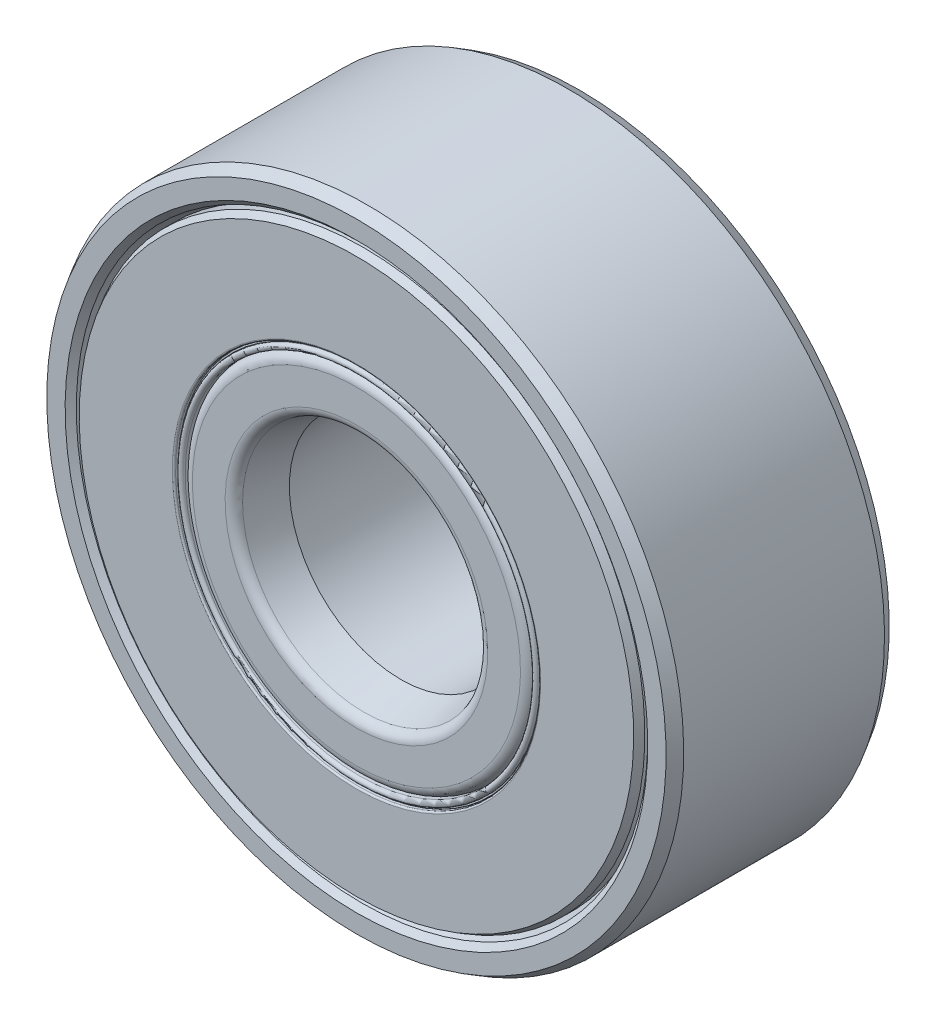
ISO-10303-21;
HEADER;
FILE_DESCRIPTION(('STEP AP214'),'2;1');
FILE_NAME('part.step','',(''),(''),'','','');
FILE_SCHEMA(('AUTOMOTIVE_DESIGN { 1 0 10303 214 1 1 1 1 }'));
ENDSEC;
DATA;
#1=APPLICATION_CONTEXT('core data for automotive mechanical design processes');
#2=APPLICATION_PROTOCOL_DEFINITION('international standard','automotive_design',2000,#1);
#3=PRODUCT_CONTEXT('',#1,'mechanical');
#4=PRODUCT('Part','Part','',(#3));
#5=PRODUCT_RELATED_PRODUCT_CATEGORY('part','',(#4));
#6=PRODUCT_DEFINITION_FORMATION('','',#4);
#7=PRODUCT_DEFINITION_CONTEXT('part definition',#1,'design');
#8=PRODUCT_DEFINITION('design','',#6,#7);
#9=PRODUCT_DEFINITION_SHAPE('','',#8);
#10=(LENGTH_UNIT() NAMED_UNIT(*) SI_UNIT(.MILLI.,.METRE.));
#11=(NAMED_UNIT(*) PLANE_ANGLE_UNIT() SI_UNIT($,.RADIAN.));
#12=(NAMED_UNIT(*) SI_UNIT($,.STERADIAN.) SOLID_ANGLE_UNIT());
#13=UNCERTAINTY_MEASURE_WITH_UNIT(LENGTH_MEASURE(1.E-05),#10,'distance_accuracy_value','');
#14=(GEOMETRIC_REPRESENTATION_CONTEXT(3) GLOBAL_UNCERTAINTY_ASSIGNED_CONTEXT((#13)) GLOBAL_UNIT_ASSIGNED_CONTEXT((#10,
#11,#12)) REPRESENTATION_CONTEXT('',''));
#15=CARTESIAN_POINT('',(0.,0.,0.));
#16=DIRECTION('',(0.,0.,1.));
#17=DIRECTION('',(1.,0.,0.));
#18=AXIS2_PLACEMENT_3D('',#15,#16,#17);
#19=CARTESIAN_POINT('',(0.,4.68666666666667,2.0625));
#20=DIRECTION('',(0.,0.,1.));
#21=DIRECTION('',(0.,-1.,0.));
#22=AXIS2_PLACEMENT_3D('',#19,#20,#21);
#23=PLANE('',#22);
#24=CARTESIAN_POINT('',(0.,0.,2.0625));
#25=DIRECTION('',(0.,0.,1.));
#26=DIRECTION('',(0.,-1.,0.));
#27=AXIS2_PLACEMENT_3D('',#24,#25,#26);
#28=CIRCLE('',#27,4.90666666666667);
#29=CARTESIAN_POINT('',(0.,-4.90666666666667,2.0625));
#30=VERTEX_POINT('',#29);
#31=EDGE_CURVE('E11',#30,#30,#28,.T.);
#32=ORIENTED_EDGE('',*,*,#31,.F.);
#33=EDGE_LOOP('',(#32));
#34=FACE_BOUND('',#33,.T.);
#35=CARTESIAN_POINT('',(0.,0.,2.0625));
#36=DIRECTION('',(0.,0.,1.));
#37=DIRECTION('',(0.,-1.,0.));
#38=AXIS2_PLACEMENT_3D('',#35,#36,#37);
#39=CIRCLE('',#38,4.68666666666667);
#40=CARTESIAN_POINT('',(0.,-4.68666666666667,2.0625));
#41=VERTEX_POINT('',#40);
#42=EDGE_CURVE('E66',#41,#41,#39,.T.);
#43=ORIENTED_EDGE('',*,*,#42,.T.);
#44=EDGE_LOOP('',(#43));
#45=FACE_BOUND('',#44,.T.);
#46=ADVANCED_FACE('F41',(#34,#45),#23,.F.);
#47=CARTESIAN_POINT('',(0.,0.,3.));
#48=DIRECTION('',(0.,0.,1.));
#49=DIRECTION('',(0.,-1.,0.));
#50=AXIS2_PLACEMENT_3D('',#47,#48,#49);
#51=CYLINDRICAL_SURFACE('',#50,4.90666666666667);
#52=CARTESIAN_POINT('',(0.,0.,2.84231187649393));
#53=DIRECTION('',(0.,0.,1.));
#54=DIRECTION('',(0.,-1.,0.));
#55=AXIS2_PLACEMENT_3D('',#52,#53,#54);
#56=CIRCLE('',#55,4.90666666666667);
#57=CARTESIAN_POINT('',(0.,-4.90666666666667,2.84231187649393));
#58=VERTEX_POINT('',#57);
#59=EDGE_CURVE('E47',#58,#58,#56,.T.);
#60=ORIENTED_EDGE('',*,*,#59,.F.);
#61=EDGE_LOOP('',(#60));
#62=FACE_BOUND('',#61,.T.);
#63=ORIENTED_EDGE('',*,*,#31,.T.);
#64=EDGE_LOOP('',(#63));
#65=FACE_BOUND('',#64,.T.);
#66=ADVANCED_FACE('F97',(#62,#65),#51,.T.);
#67=CARTESIAN_POINT('',(0.,0.,2.84231187649393));
#68=DIRECTION('',(0.,0.,-1.));
#69=DIRECTION('',(0.,1.,0.));
#70=AXIS2_PLACEMENT_3D('',#67,#68,#69);
#71=CONICAL_SURFACE('',#70,4.90666666666667,0.174532925199405);
#72=CARTESIAN_POINT('',(0.,0.,2.8964763029096));
#73=DIRECTION('',(0.,0.,1.));
#74=DIRECTION('',(0.,-1.,0.));
#75=AXIS2_PLACEMENT_3D('',#72,#73,#74);
#76=CIRCLE('',#75,4.89711601689499);
#77=CARTESIAN_POINT('',(0.,-4.89711601689499,2.8964763029096));
#78=VERTEX_POINT('',#77);
#79=EDGE_CURVE('E51',#78,#78,#76,.T.);
#80=ORIENTED_EDGE('',*,*,#79,.F.);
#81=EDGE_LOOP('',(#80));
#82=FACE_BOUND('',#81,.T.);
#83=ORIENTED_EDGE('',*,*,#59,.T.);
#84=EDGE_LOOP('',(#83));
#85=FACE_BOUND('',#84,.T.);
#86=ADVANCED_FACE('F92',(#82,#85),#71,.T.);
#87=CARTESIAN_POINT('',(0.,0.,2.8925));
#88=DIRECTION('',(0.,0.,1.));
#89=DIRECTION('',(0.,-1.,0.));
#90=AXIS2_PLACEMENT_3D('',#87,#88,#89);
#91=TOROIDAL_SURFACE('',#90,4.8745652824945,0.0228986158278282);
#92=CARTESIAN_POINT('',(0.,0.,2.8925));
#93=DIRECTION('',(0.,0.,1.));
#94=DIRECTION('',(0.,-1.,0.));
#95=AXIS2_PLACEMENT_3D('',#92,#93,#94);
#96=CIRCLE('',#95,4.85166666666667);
#97=CARTESIAN_POINT('',(0.,-4.85166666666667,2.8925));
#98=VERTEX_POINT('',#97);
#99=EDGE_CURVE('E55',#98,#98,#96,.T.);
#100=ORIENTED_EDGE('',*,*,#99,.F.);
#101=EDGE_LOOP('',(#100));
#102=FACE_BOUND('',#101,.T.);
#103=ORIENTED_EDGE('',*,*,#79,.T.);
#104=EDGE_LOOP('',(#103));
#105=FACE_BOUND('',#104,.T.);
#106=ADVANCED_FACE('F86',(#102,#105),#91,.T.);
#107=CARTESIAN_POINT('',(0.,0.,3.));
#108=DIRECTION('',(0.,0.,1.));
#109=DIRECTION('',(0.,-1.,0.));
#110=AXIS2_PLACEMENT_3D('',#107,#108,#109);
#111=CYLINDRICAL_SURFACE('',#110,4.85166666666667);
#112=CARTESIAN_POINT('',(0.,0.,2.9175));
#113=DIRECTION('',(0.,0.,1.));
#114=DIRECTION('',(0.,-1.,0.));
#115=AXIS2_PLACEMENT_3D('',#112,#113,#114);
#116=CIRCLE('',#115,4.85166666666667);
#117=CARTESIAN_POINT('',(0.,-4.85166666666667,2.9175));
#118=VERTEX_POINT('',#117);
#119=EDGE_CURVE('E60',#118,#118,#116,.T.);
#120=ORIENTED_EDGE('',*,*,#119,.F.);
#121=EDGE_LOOP('',(#120));
#122=FACE_BOUND('',#121,.T.);
#123=ORIENTED_EDGE('',*,*,#99,.T.);
#124=EDGE_LOOP('',(#123));
#125=FACE_BOUND('',#124,.T.);
#126=ADVANCED_FACE('F80',(#122,#125),#111,.T.);
#127=CARTESIAN_POINT('',(0.,0.,2.9175));
#128=DIRECTION('',(0.,0.,1.));
#129=DIRECTION('',(0.,-1.,0.));
#130=AXIS2_PLACEMENT_3D('',#127,#128,#129);
#131=TOROIDAL_SURFACE('',#130,4.76916666666667,0.0825000000000001);
#132=CARTESIAN_POINT('',(0.,0.,2.9175));
#133=DIRECTION('',(0.,0.,1.));
#134=DIRECTION('',(0.,-1.,0.));
#135=AXIS2_PLACEMENT_3D('',#132,#133,#134);
#136=CIRCLE('',#135,4.68666666666667);
#137=CARTESIAN_POINT('',(0.,-4.68666666666667,2.9175));
#138=VERTEX_POINT('',#137);
#139=EDGE_CURVE('E63',#138,#138,#136,.T.);
#140=ORIENTED_EDGE('',*,*,#139,.F.);
#141=EDGE_LOOP('',(#140));
#142=FACE_BOUND('',#141,.T.);
#143=ORIENTED_EDGE('',*,*,#119,.T.);
#144=EDGE_LOOP('',(#143));
#145=FACE_BOUND('',#144,.T.);
#146=ADVANCED_FACE('F74',(#142,#145),#131,.T.);
#147=CARTESIAN_POINT('',(0.,0.,3.));
#148=DIRECTION('',(0.,0.,1.));
#149=DIRECTION('',(0.,-1.,0.));
#150=AXIS2_PLACEMENT_3D('',#147,#148,#149);
#151=CYLINDRICAL_SURFACE('',#150,4.68666666666667);
#152=ORIENTED_EDGE('',*,*,#42,.F.);
#153=EDGE_LOOP('',(#152));
#154=FACE_BOUND('',#153,.T.);
#155=ORIENTED_EDGE('',*,*,#139,.T.);
#156=EDGE_LOOP('',(#155));
#157=FACE_BOUND('',#156,.T.);
#158=ADVANCED_FACE('F71',(#154,#157),#151,.F.);
#159=CLOSED_SHELL('',(#46,#66,#86,#106,#126,#146,#158));
#160=MANIFOLD_SOLID_BREP('B2',#159);
#161=CARTESIAN_POINT('',(0.,0.,-3.00000000000001));
#162=DIRECTION('',(0.,0.,1.));
#163=DIRECTION('',(0.,-1.,0.));
#164=AXIS2_PLACEMENT_3D('',#161,#162,#163);
#165=CONICAL_SURFACE('',#164,7.455,0.523598775598301);
#166=CARTESIAN_POINT('',(0.,0.,-2.80947441116743));
#167=DIRECTION('',(0.,0.,1.));
#168=DIRECTION('',(0.,-1.,0.));
#169=AXIS2_PLACEMENT_3D('',#166,#167,#168);
#170=CIRCLE('',#169,7.565);
#171=CARTESIAN_POINT('',(0.,-7.565,-2.80947441116743));
#172=VERTEX_POINT('',#171);
#173=EDGE_CURVE('E177',#172,#172,#170,.T.);
#174=ORIENTED_EDGE('',*,*,#173,.F.);
#175=EDGE_LOOP('',(#174));
#176=FACE_BOUND('',#175,.T.);
#177=CARTESIAN_POINT('',(0.,0.,-3.00000000000001));
#178=DIRECTION('',(0.,0.,1.));
#179=DIRECTION('',(0.,-1.,0.));
#180=AXIS2_PLACEMENT_3D('',#177,#178,#179);
#181=CIRCLE('',#180,7.455);
#182=CARTESIAN_POINT('',(0.,-7.455,-3.00000000000001));
#183=VERTEX_POINT('',#182);
#184=EDGE_CURVE('E40',#183,#183,#181,.T.);
#185=ORIENTED_EDGE('',*,*,#184,.T.);
#186=EDGE_LOOP('',(#185));
#187=FACE_BOUND('',#186,.T.);
#188=ADVANCED_FACE('F155',(#176,#187),#165,.T.);
#189=CARTESIAN_POINT('',(0.,7.455,-3.));
#190=DIRECTION('',(0.,0.,1.));
#191=DIRECTION('',(0.,-1.,0.));
#192=AXIS2_PLACEMENT_3D('',#189,#190,#191);
#193=PLANE('',#192);
#194=ORIENTED_EDGE('',*,*,#184,.F.);
#195=EDGE_LOOP('',(#194));
#196=FACE_BOUND('',#195,.T.);
#197=CARTESIAN_POINT('',(0.,0.,-3.00000000000001));
#198=DIRECTION('',(0.,0.,1.));
#199=DIRECTION('',(0.,-1.,0.));
#200=AXIS2_PLACEMENT_3D('',#197,#198,#199);
#201=CIRCLE('',#200,4.95066666666667);
#202=CARTESIAN_POINT('',(0.,-4.95066666666666,-3.00000000000001));
#203=VERTEX_POINT('',#202);
#204=EDGE_CURVE('E161',#203,#203,#201,.T.);
#205=ORIENTED_EDGE('',*,*,#204,.T.);
#206=EDGE_LOOP('',(#205));
#207=FACE_BOUND('',#206,.T.);
#208=ADVANCED_FACE('F184',(#196,#207),#193,.F.);
#209=CARTESIAN_POINT('',(0.,0.,-2.956));
#210=DIRECTION('',(0.,0.,1.));
#211=DIRECTION('',(0.,-1.,0.));
#212=AXIS2_PLACEMENT_3D('',#209,#210,#211);
#213=TOROIDAL_SURFACE('',#212,4.95066666666667,0.0439999999999996);
#214=ORIENTED_EDGE('',*,*,#204,.F.);
#215=EDGE_LOOP('',(#214));
#216=FACE_BOUND('',#215,.T.);
#217=CARTESIAN_POINT('',(0.,0.,-2.95600000000001));
#218=DIRECTION('',(0.,0.,1.));
#219=DIRECTION('',(0.,-1.,0.));
#220=AXIS2_PLACEMENT_3D('',#217,#218,#219);
#221=CIRCLE('',#220,4.90666666666667);
#222=CARTESIAN_POINT('',(0.,-4.90666666666667,-2.95600000000001));
#223=VERTEX_POINT('',#222);
#224=EDGE_CURVE('E165',#223,#223,#221,.T.);
#225=ORIENTED_EDGE('',*,*,#224,.T.);
#226=EDGE_LOOP('',(#225));
#227=FACE_BOUND('',#226,.T.);
#228=ADVANCED_FACE('F188',(#216,#227),#213,.T.);
#229=CARTESIAN_POINT('',(0.,0.,3.));
#230=DIRECTION('',(0.,0.,1.));
#231=DIRECTION('',(0.,-1.,0.));
#232=AXIS2_PLACEMENT_3D('',#229,#230,#231);
#233=CYLINDRICAL_SURFACE('',#232,4.90666666666667);
#234=ORIENTED_EDGE('',*,*,#224,.F.);
#235=EDGE_LOOP('',(#234));
#236=FACE_BOUND('',#235,.T.);
#237=CARTESIAN_POINT('',(0.,0.,-2.0625));
#238=DIRECTION('',(0.,0.,1.));
#239=DIRECTION('',(0.,-1.,0.));
#240=AXIS2_PLACEMENT_3D('',#237,#238,#239);
#241=CIRCLE('',#240,4.90666666666667);
#242=CARTESIAN_POINT('',(0.,-4.90666666666667,-2.0625));
#243=VERTEX_POINT('',#242);
#244=EDGE_CURVE('E169',#243,#243,#241,.T.);
#245=ORIENTED_EDGE('',*,*,#244,.T.);
#246=EDGE_LOOP('',(#245));
#247=FACE_BOUND('',#246,.T.);
#248=ADVANCED_FACE('F193',(#236,#247),#233,.F.);
#249=CARTESIAN_POINT('',(0.,7.565,-2.0625));
#250=DIRECTION('',(0.,0.,-1.));
#251=DIRECTION('',(0.,1.,0.));
#252=AXIS2_PLACEMENT_3D('',#249,#250,#251);
#253=PLANE('',#252);
#254=ORIENTED_EDGE('',*,*,#244,.F.);
#255=EDGE_LOOP('',(#254));
#256=FACE_BOUND('',#255,.T.);
#257=CARTESIAN_POINT('',(0.,0.,-2.0625));
#258=DIRECTION('',(0.,0.,1.));
#259=DIRECTION('',(0.,-1.,0.));
#260=AXIS2_PLACEMENT_3D('',#257,#258,#259);
#261=CIRCLE('',#260,7.565);
#262=CARTESIAN_POINT('',(0.,-7.565,-2.0625));
#263=VERTEX_POINT('',#262);
#264=EDGE_CURVE('E174',#263,#263,#261,.T.);
#265=ORIENTED_EDGE('',*,*,#264,.T.);
#266=EDGE_LOOP('',(#265));
#267=FACE_BOUND('',#266,.T.);
#268=ADVANCED_FACE('F199',(#256,#267),#253,.F.);
#269=CARTESIAN_POINT('',(0.,0.,3.));
#270=DIRECTION('',(0.,0.,1.));
#271=DIRECTION('',(0.,-1.,0.));
#272=AXIS2_PLACEMENT_3D('',#269,#270,#271);
#273=CYLINDRICAL_SURFACE('',#272,7.565);
#274=ORIENTED_EDGE('',*,*,#264,.F.);
#275=EDGE_LOOP('',(#274));
#276=FACE_BOUND('',#275,.T.);
#277=ORIENTED_EDGE('',*,*,#173,.T.);
#278=EDGE_LOOP('',(#277));
#279=FACE_BOUND('',#278,.T.);
#280=ADVANCED_FACE('F181',(#276,#279),#273,.T.);
#281=CLOSED_SHELL('',(#188,#208,#228,#248,#268,#280));
#282=MANIFOLD_SOLID_BREP('B6',#281);
#283=CARTESIAN_POINT('',(0.,7.565,2.0625));
#284=DIRECTION('',(0.,0.,1.));
#285=DIRECTION('',(0.,-1.,0.));
#286=AXIS2_PLACEMENT_3D('',#283,#284,#285);
#287=PLANE('',#286);
#288=CARTESIAN_POINT('',(0.,0.,2.0625));
#289=DIRECTION('',(0.,0.,1.));
#290=DIRECTION('',(0.,-1.,0.));
#291=AXIS2_PLACEMENT_3D('',#288,#289,#290);
#292=CIRCLE('',#291,7.565);
#293=CARTESIAN_POINT('',(0.,-7.565,2.0625));
#294=VERTEX_POINT('',#293);
#295=EDGE_CURVE('E154',#294,#294,#292,.T.);
#296=ORIENTED_EDGE('',*,*,#295,.F.);
#297=EDGE_LOOP('',(#296));
#298=FACE_BOUND('',#297,.T.);
#299=CARTESIAN_POINT('',(0.,0.,2.0625));
#300=DIRECTION('',(0.,0.,1.));
#301=DIRECTION('',(0.,-1.,0.));
#302=AXIS2_PLACEMENT_3D('',#299,#300,#301);
#303=CIRCLE('',#302,4.90666666666667);
#304=CARTESIAN_POINT('',(0.,-4.90666666666667,2.0625));
#305=VERTEX_POINT('',#304);
#306=EDGE_CURVE('E274',#305,#305,#303,.T.);
#307=ORIENTED_EDGE('',*,*,#306,.T.);
#308=EDGE_LOOP('',(#307));
#309=FACE_BOUND('',#308,.T.);
#310=ADVANCED_FACE('F252',(#298,#309),#287,.F.);
#311=CARTESIAN_POINT('',(0.,0.,3.));
#312=DIRECTION('',(0.,0.,1.));
#313=DIRECTION('',(0.,-1.,0.));
#314=AXIS2_PLACEMENT_3D('',#311,#312,#313);
#315=CYLINDRICAL_SURFACE('',#314,7.565);
#316=CARTESIAN_POINT('',(0.,0.,2.80947441116743));
#317=DIRECTION('',(0.,0.,1.));
#318=DIRECTION('',(0.,-1.,0.));
#319=AXIS2_PLACEMENT_3D('',#316,#317,#318);
#320=CIRCLE('',#319,7.565);
#321=CARTESIAN_POINT('',(0.,-7.565,2.80947441116742));
#322=VERTEX_POINT('',#321);
#323=EDGE_CURVE('E258',#322,#322,#320,.T.);
#324=ORIENTED_EDGE('',*,*,#323,.F.);
#325=EDGE_LOOP('',(#324));
#326=FACE_BOUND('',#325,.T.);
#327=ORIENTED_EDGE('',*,*,#295,.T.);
#328=EDGE_LOOP('',(#327));
#329=FACE_BOUND('',#328,.T.);
#330=ADVANCED_FACE('F299',(#326,#329),#315,.T.);
#331=CARTESIAN_POINT('',(0.,0.,2.80947441116743));
#332=DIRECTION('',(0.,0.,-1.));
#333=DIRECTION('',(0.,1.,0.));
#334=AXIS2_PLACEMENT_3D('',#331,#332,#333);
#335=CONICAL_SURFACE('',#334,7.565,0.523598775598301);
#336=CARTESIAN_POINT('',(0.,0.,3.));
#337=DIRECTION('',(0.,0.,1.));
#338=DIRECTION('',(0.,-1.,0.));
#339=AXIS2_PLACEMENT_3D('',#336,#337,#338);
#340=CIRCLE('',#339,7.455);
#341=CARTESIAN_POINT('',(0.,-7.455,3.));
#342=VERTEX_POINT('',#341);
#343=EDGE_CURVE('E262',#342,#342,#340,.T.);
#344=ORIENTED_EDGE('',*,*,#343,.F.);
#345=EDGE_LOOP('',(#344));
#346=FACE_BOUND('',#345,.T.);
#347=ORIENTED_EDGE('',*,*,#323,.T.);
#348=EDGE_LOOP('',(#347));
#349=FACE_BOUND('',#348,.T.);
#350=ADVANCED_FACE('F294',(#346,#349),#335,.T.);
#351=CARTESIAN_POINT('',(0.,7.455,3.));
#352=DIRECTION('',(0.,0.,-1.));
#353=DIRECTION('',(0.,1.,0.));
#354=AXIS2_PLACEMENT_3D('',#351,#352,#353);
#355=PLANE('',#354);
#356=CARTESIAN_POINT('',(0.,0.,3.));
#357=DIRECTION('',(0.,0.,1.));
#358=DIRECTION('',(0.,-1.,0.));
#359=AXIS2_PLACEMENT_3D('',#356,#357,#358);
#360=CIRCLE('',#359,4.95066666666667);
#361=CARTESIAN_POINT('',(0.,-4.95066666666667,3.));
#362=VERTEX_POINT('',#361);
#363=EDGE_CURVE('E266',#362,#362,#360,.T.);
#364=ORIENTED_EDGE('',*,*,#363,.F.);
#365=EDGE_LOOP('',(#364));
#366=FACE_BOUND('',#365,.T.);
#367=ORIENTED_EDGE('',*,*,#343,.T.);
#368=EDGE_LOOP('',(#367));
#369=FACE_BOUND('',#368,.T.);
#370=ADVANCED_FACE('F288',(#366,#369),#355,.F.);
#371=CARTESIAN_POINT('',(0.,0.,2.956));
#372=DIRECTION('',(0.,0.,1.));
#373=DIRECTION('',(0.,-1.,0.));
#374=AXIS2_PLACEMENT_3D('',#371,#372,#373);
#375=TOROIDAL_SURFACE('',#374,4.95066666666667,0.0439999999999996);
#376=CARTESIAN_POINT('',(0.,0.,2.956));
#377=DIRECTION('',(0.,0.,1.));
#378=DIRECTION('',(0.,-1.,0.));
#379=AXIS2_PLACEMENT_3D('',#376,#377,#378);
#380=CIRCLE('',#379,4.90666666666667);
#381=CARTESIAN_POINT('',(0.,-4.90666666666667,2.956));
#382=VERTEX_POINT('',#381);
#383=EDGE_CURVE('E271',#382,#382,#380,.T.);
#384=ORIENTED_EDGE('',*,*,#383,.F.);
#385=EDGE_LOOP('',(#384));
#386=FACE_BOUND('',#385,.T.);
#387=ORIENTED_EDGE('',*,*,#363,.T.);
#388=EDGE_LOOP('',(#387));
#389=FACE_BOUND('',#388,.T.);
#390=ADVANCED_FACE('F282',(#386,#389),#375,.T.);
#391=CARTESIAN_POINT('',(0.,0.,3.));
#392=DIRECTION('',(0.,0.,1.));
#393=DIRECTION('',(0.,-1.,0.));
#394=AXIS2_PLACEMENT_3D('',#391,#392,#393);
#395=CYLINDRICAL_SURFACE('',#394,4.90666666666667);
#396=ORIENTED_EDGE('',*,*,#306,.F.);
#397=EDGE_LOOP('',(#396));
#398=FACE_BOUND('',#397,.T.);
#399=ORIENTED_EDGE('',*,*,#383,.T.);
#400=EDGE_LOOP('',(#399));
#401=FACE_BOUND('',#400,.T.);
#402=ADVANCED_FACE('F279',(#398,#401),#395,.F.);
#403=CLOSED_SHELL('',(#310,#330,#350,#370,#390,#402));
#404=MANIFOLD_SOLID_BREP('B35',#403);
#405=CARTESIAN_POINT('',(-4.78936935635203,3.81939461121968,0.));
#406=DIRECTION('',(0.,0.,1.));
#407=DIRECTION('',(-0.781831482468022,0.623489801858743,0.));
#408=AXIS2_PLACEMENT_3D('',#405,#406,#407);
#409=SPHERICAL_SURFACE('',#408,2.0625);
#410=CARTESIAN_POINT('',(-4.78936935635203,3.81939461121968,2.0625));
#411=VERTEX_POINT('',#410);
#412=VERTEX_LOOP('',#411);
#413=FACE_BOUND('',#412,.T.);
#414=ADVANCED_FACE('F362',(#413),#409,.T.);
#415=CLOSED_SHELL('',(#414));
#416=MANIFOLD_SOLID_BREP('B149',#415);
#417=CARTESIAN_POINT('',(-5.9722459020405,-1.363126154594,0.));
#418=DIRECTION('',(0.,0.,1.));
#419=DIRECTION('',(-0.974927912181826,-0.222520933956305,0.));
#420=AXIS2_PLACEMENT_3D('',#417,#418,#419);
#421=SPHERICAL_SURFACE('',#420,2.0625);
#422=CARTESIAN_POINT('',(-5.9722459020405,-1.363126154594,2.0625));
#423=VERTEX_POINT('',#422);
#424=VERTEX_LOOP('',#423);
#425=FACE_BOUND('',#424,.T.);
#426=ADVANCED_FACE('F380',(#425),#421,.T.);
#427=CLOSED_SHELL('',(#426));
#428=MANIFOLD_SOLID_BREP('B248',#427);
#429=CARTESIAN_POINT('',(-2.65789947187768,-5.51918512329221,0.));
#430=DIRECTION('',(0.,0.,1.));
#431=DIRECTION('',(-0.433883739117565,-0.900968867902416,0.));
#432=AXIS2_PLACEMENT_3D('',#429,#430,#431);
#433=SPHERICAL_SURFACE('',#432,2.0625);
#434=CARTESIAN_POINT('',(-2.65789947187768,-5.51918512329222,2.0625));
#435=VERTEX_POINT('',#434);
#436=VERTEX_LOOP('',#435);
#437=FACE_BOUND('',#436,.T.);
#438=ADVANCED_FACE('F398',(#437),#433,.T.);
#439=CLOSED_SHELL('',(#438));
#440=MANIFOLD_SOLID_BREP('B358',#439);
#441=CARTESIAN_POINT('',(2.65789947187761,-5.51918512329225,0.));
#442=DIRECTION('',(0.,0.,1.));
#443=DIRECTION('',(0.433883739117553,-0.900968867902422,0.));
#444=AXIS2_PLACEMENT_3D('',#441,#442,#443);
#445=SPHERICAL_SURFACE('',#444,2.0625);
#446=CARTESIAN_POINT('',(2.65789947187761,-5.51918512329225,2.0625));
#447=VERTEX_POINT('',#446);
#448=VERTEX_LOOP('',#447);
#449=FACE_BOUND('',#448,.T.);
#450=ADVANCED_FACE('F416',(#449),#445,.T.);
#451=CLOSED_SHELL('',(#450));
#452=MANIFOLD_SOLID_BREP('B376',#451);
#453=CARTESIAN_POINT('',(5.97224590204048,-1.36312615459408,0.));
#454=DIRECTION('',(0.,0.,1.));
#455=DIRECTION('',(0.974927912181823,-0.222520933956318,0.));
#456=AXIS2_PLACEMENT_3D('',#453,#454,#455);
#457=SPHERICAL_SURFACE('',#456,2.0625);
#458=CARTESIAN_POINT('',(5.97224590204048,-1.36312615459408,2.0625));
#459=VERTEX_POINT('',#458);
#460=VERTEX_LOOP('',#459);
#461=FACE_BOUND('',#460,.T.);
#462=ADVANCED_FACE('F434',(#461),#457,.T.);
#463=CLOSED_SHELL('',(#462));
#464=MANIFOLD_SOLID_BREP('B394',#463);
#465=CARTESIAN_POINT('',(4.78936935635208,3.81939461121962,0.));
#466=DIRECTION('',(0.,0.,1.));
#467=DIRECTION('',(0.781831482468031,0.623489801858732,0.));
#468=AXIS2_PLACEMENT_3D('',#465,#466,#467);
#469=SPHERICAL_SURFACE('',#468,2.0625);
#470=CARTESIAN_POINT('',(4.78936935635208,3.81939461121962,2.0625));
#471=VERTEX_POINT('',#470);
#472=VERTEX_LOOP('',#471);
#473=FACE_BOUND('',#472,.T.);
#474=ADVANCED_FACE('F452',(#473),#469,.T.);
#475=CLOSED_SHELL('',(#474));
#476=MANIFOLD_SOLID_BREP('B412',#475);
#477=CARTESIAN_POINT('',(0.,6.12583333333333,0.));
#478=DIRECTION('',(0.,0.,1.));
#479=DIRECTION('',(0.,1.,0.));
#480=AXIS2_PLACEMENT_3D('',#477,#478,#479);
#481=SPHERICAL_SURFACE('',#480,2.0625);
#482=CARTESIAN_POINT('',(0.,6.12583333333333,2.0625));
#483=VERTEX_POINT('',#482);
#484=VERTEX_LOOP('',#483);
#485=FACE_BOUND('',#484,.T.);
#486=ADVANCED_FACE('F472',(#485),#481,.T.);
#487=CLOSED_SHELL('',(#486));
#488=MANIFOLD_SOLID_BREP('B430',#487);
#489=CARTESIAN_POINT('',(0.,0.,-2.72478908204099));
#490=DIRECTION('',(0.,0.,1.));
#491=DIRECTION('',(0.,-1.,0.));
#492=AXIS2_PLACEMENT_3D('',#489,#490,#491);
#493=TOROIDAL_SURFACE('',#492,3.53166666666667,0.275210917959015);
#494=CARTESIAN_POINT('',(0.,0.,-3.));
#495=DIRECTION('',(0.,0.,1.));
#496=DIRECTION('',(0.,-1.,0.));
#497=AXIS2_PLACEMENT_3D('',#494,#495,#496);
#498=CIRCLE('',#497,3.53166666666667);
#499=CARTESIAN_POINT('',(0.,-3.53166666666666,-3.));
#500=VERTEX_POINT('',#499);
#501=EDGE_CURVE('E471',#500,#500,#498,.T.);
#502=ORIENTED_EDGE('',*,*,#501,.F.);
#503=EDGE_LOOP('',(#502));
#504=FACE_BOUND('',#503,.T.);
#505=CARTESIAN_POINT('',(0.,0.,-2.79601890902893));
#506=DIRECTION('',(0.,0.,1.));
#507=DIRECTION('',(0.,-1.,0.));
#508=AXIS2_PLACEMENT_3D('',#505,#506,#507);
#509=CIRCLE('',#508,3.26583333333333);
#510=CARTESIAN_POINT('',(0.,-3.26583333333333,-2.79601890902893));
#511=VERTEX_POINT('',#510);
#512=EDGE_CURVE('E531',#511,#511,#509,.T.);
#513=ORIENTED_EDGE('',*,*,#512,.T.);
#514=EDGE_LOOP('',(#513));
#515=FACE_BOUND('',#514,.T.);
#516=ADVANCED_FACE('F491',(#504,#515),#493,.T.);
#517=CARTESIAN_POINT('',(0.,3.53166666666667,-3.));
#518=DIRECTION('',(0.,0.,1.));
#519=DIRECTION('',(0.,-1.,0.));
#520=AXIS2_PLACEMENT_3D('',#517,#518,#519);
#521=PLANE('',#520);
#522=CARTESIAN_POINT('',(0.,0.,-3.));
#523=DIRECTION('',(0.,0.,1.));
#524=DIRECTION('',(0.,-1.,0.));
#525=AXIS2_PLACEMENT_3D('',#522,#523,#524);
#526=CIRCLE('',#525,4.41145574870765);
#527=CARTESIAN_POINT('',(0.,-4.41145574870765,-3.));
#528=VERTEX_POINT('',#527);
#529=EDGE_CURVE('E497',#528,#528,#526,.T.);
#530=ORIENTED_EDGE('',*,*,#529,.F.);
#531=EDGE_LOOP('',(#530));
#532=FACE_BOUND('',#531,.T.);
#533=ORIENTED_EDGE('',*,*,#501,.T.);
#534=EDGE_LOOP('',(#533));
#535=FACE_BOUND('',#534,.T.);
#536=ADVANCED_FACE('F592',(#532,#535),#521,.F.);
#537=CARTESIAN_POINT('',(0.,0.,-2.72478908204099));
#538=DIRECTION('',(0.,0.,1.));
#539=DIRECTION('',(0.,-1.,0.));
#540=AXIS2_PLACEMENT_3D('',#537,#538,#539);
#541=TOROIDAL_SURFACE('',#540,4.41145574870765,0.275210917959014);
#542=CARTESIAN_POINT('',(0.,0.,-2.72478908204099));
#543=DIRECTION('',(0.,0.,1.));
#544=DIRECTION('',(0.,-1.,0.));
#545=AXIS2_PLACEMENT_3D('',#542,#543,#544);
#546=CIRCLE('',#545,4.68666666666667);
#547=CARTESIAN_POINT('',(0.,-4.68666666666666,-2.72478908204099));
#548=VERTEX_POINT('',#547);
#549=EDGE_CURVE('E501',#548,#548,#546,.T.);
#550=ORIENTED_EDGE('',*,*,#549,.F.);
#551=EDGE_LOOP('',(#550));
#552=FACE_BOUND('',#551,.T.);
#553=ORIENTED_EDGE('',*,*,#529,.T.);
#554=EDGE_LOOP('',(#553));
#555=FACE_BOUND('',#554,.T.);
#556=ADVANCED_FACE('F587',(#552,#555),#541,.T.);
#557=CARTESIAN_POINT('',(0.,0.,3.));
#558=DIRECTION('',(0.,0.,1.));
#559=DIRECTION('',(0.,-1.,0.));
#560=AXIS2_PLACEMENT_3D('',#557,#558,#559);
#561=CYLINDRICAL_SURFACE('',#560,4.68666666666667);
#562=CARTESIAN_POINT('',(0.,0.,-1.47739823864643));
#563=DIRECTION('',(0.,0.,1.));
#564=DIRECTION('',(0.,-1.,0.));
#565=AXIS2_PLACEMENT_3D('',#562,#563,#564);
#566=CIRCLE('',#565,4.68666666666667);
#567=CARTESIAN_POINT('',(0.,-4.68666666666667,-1.47739823864643));
#568=VERTEX_POINT('',#567);
#569=EDGE_CURVE('E505',#568,#568,#566,.T.);
#570=ORIENTED_EDGE('',*,*,#569,.F.);
#571=EDGE_LOOP('',(#570));
#572=FACE_BOUND('',#571,.T.);
#573=ORIENTED_EDGE('',*,*,#549,.T.);
#574=EDGE_LOOP('',(#573));
#575=FACE_BOUND('',#574,.T.);
#576=ADVANCED_FACE('F581',(#572,#575),#561,.T.);
#577=CARTESIAN_POINT('',(0.,0.,0.));
#578=DIRECTION('',(0.,0.,1.));
#579=DIRECTION('',(0.,-1.,0.));
#580=AXIS2_PLACEMENT_3D('',#577,#578,#579);
#581=TOROIDAL_SURFACE('',#580,6.12583333333333,2.0625);
#582=CARTESIAN_POINT('',(0.,0.,1.47739823864642));
#583=DIRECTION('',(0.,0.,1.));
#584=DIRECTION('',(0.,-1.,0.));
#585=AXIS2_PLACEMENT_3D('',#582,#583,#584);
#586=CIRCLE('',#585,4.68666666666667);
#587=CARTESIAN_POINT('',(0.,-4.68666666666667,1.47739823864642));
#588=VERTEX_POINT('',#587);
#589=EDGE_CURVE('E510',#588,#588,#586,.T.);
#590=ORIENTED_EDGE('',*,*,#589,.F.);
#591=EDGE_LOOP('',(#590));
#592=FACE_BOUND('',#591,.T.);
#593=ORIENTED_EDGE('',*,*,#569,.T.);
#594=EDGE_LOOP('',(#593));
#595=FACE_BOUND('',#594,.T.);
#596=ADVANCED_FACE('F575',(#592,#595),#581,.F.);
#597=CARTESIAN_POINT('',(0.,0.,3.));
#598=DIRECTION('',(0.,0.,1.));
#599=DIRECTION('',(0.,-1.,0.));
#600=AXIS2_PLACEMENT_3D('',#597,#598,#599);
#601=CYLINDRICAL_SURFACE('',#600,4.68666666666667);
#602=CARTESIAN_POINT('',(0.,0.,2.72478908204099));
#603=DIRECTION('',(0.,0.,1.));
#604=DIRECTION('',(0.,-1.,0.));
#605=AXIS2_PLACEMENT_3D('',#602,#603,#604);
#606=CIRCLE('',#605,4.68666666666667);
#607=CARTESIAN_POINT('',(0.,-4.68666666666667,2.72478908204099));
#608=VERTEX_POINT('',#607);
#609=EDGE_CURVE('E513',#608,#608,#606,.T.);
#610=ORIENTED_EDGE('',*,*,#609,.F.);
#611=EDGE_LOOP('',(#610));
#612=FACE_BOUND('',#611,.T.);
#613=ORIENTED_EDGE('',*,*,#589,.T.);
#614=EDGE_LOOP('',(#613));
#615=FACE_BOUND('',#614,.T.);
#616=ADVANCED_FACE('F569',(#612,#615),#601,.T.);
#617=CARTESIAN_POINT('',(0.,0.,2.72478908204099));
#618=DIRECTION('',(0.,0.,1.));
#619=DIRECTION('',(0.,-1.,0.));
#620=AXIS2_PLACEMENT_3D('',#617,#618,#619);
#621=TOROIDAL_SURFACE('',#620,4.41145574870765,0.275210917959014);
#622=CARTESIAN_POINT('',(0.,0.,3.));
#623=DIRECTION('',(0.,0.,1.));
#624=DIRECTION('',(0.,-1.,0.));
#625=AXIS2_PLACEMENT_3D('',#622,#623,#624);
#626=CIRCLE('',#625,4.41145574870765);
#627=CARTESIAN_POINT('',(0.,-4.41145574870765,3.));
#628=VERTEX_POINT('',#627);
#629=EDGE_CURVE('E516',#628,#628,#626,.T.);
#630=ORIENTED_EDGE('',*,*,#629,.F.);
#631=EDGE_LOOP('',(#630));
#632=FACE_BOUND('',#631,.T.);
#633=ORIENTED_EDGE('',*,*,#609,.T.);
#634=EDGE_LOOP('',(#633));
#635=FACE_BOUND('',#634,.T.);
#636=ADVANCED_FACE('F563',(#632,#635),#621,.T.);
#637=CARTESIAN_POINT('',(0.,3.53166666666667,3.));
#638=DIRECTION('',(0.,0.,-1.));
#639=DIRECTION('',(0.,1.,0.));
#640=AXIS2_PLACEMENT_3D('',#637,#638,#639);
#641=PLANE('',#640);
#642=CARTESIAN_POINT('',(0.,0.,3.));
#643=DIRECTION('',(0.,0.,1.));
#644=DIRECTION('',(0.,-1.,0.));
#645=AXIS2_PLACEMENT_3D('',#642,#643,#644);
#646=CIRCLE('',#645,3.53166666666667);
#647=CARTESIAN_POINT('',(0.,-3.53166666666667,3.));
#648=VERTEX_POINT('',#647);
#649=EDGE_CURVE('E519',#648,#648,#646,.T.);
#650=ORIENTED_EDGE('',*,*,#649,.F.);
#651=EDGE_LOOP('',(#650));
#652=FACE_BOUND('',#651,.T.);
#653=ORIENTED_EDGE('',*,*,#629,.T.);
#654=EDGE_LOOP('',(#653));
#655=FACE_BOUND('',#654,.T.);
#656=ADVANCED_FACE('F557',(#652,#655),#641,.F.);
#657=CARTESIAN_POINT('',(0.,0.,2.72478908204099));
#658=DIRECTION('',(0.,0.,1.));
#659=DIRECTION('',(0.,-1.,0.));
#660=AXIS2_PLACEMENT_3D('',#657,#658,#659);
#661=TOROIDAL_SURFACE('',#660,3.53166666666667,0.275210917959015);
#662=CARTESIAN_POINT('',(0.,0.,2.79601890902893));
#663=DIRECTION('',(0.,0.,1.));
#664=DIRECTION('',(0.,-1.,0.));
#665=AXIS2_PLACEMENT_3D('',#662,#663,#664);
#666=CIRCLE('',#665,3.26583333333333);
#667=CARTESIAN_POINT('',(0.,-3.26583333333333,2.79601890902893));
#668=VERTEX_POINT('',#667);
#669=EDGE_CURVE('E522',#668,#668,#666,.T.);
#670=ORIENTED_EDGE('',*,*,#669,.F.);
#671=EDGE_LOOP('',(#670));
#672=FACE_BOUND('',#671,.T.);
#673=ORIENTED_EDGE('',*,*,#649,.T.);
#674=EDGE_LOOP('',(#673));
#675=FACE_BOUND('',#674,.T.);
#676=ADVANCED_FACE('F551',(#672,#675),#661,.T.);
#677=CARTESIAN_POINT('',(0.,0.,2.79601890902893));
#678=DIRECTION('',(0.,0.,1.));
#679=DIRECTION('',(0.,-1.,0.));
#680=AXIS2_PLACEMENT_3D('',#677,#678,#679);
#681=CONICAL_SURFACE('',#680,3.26583333333333,0.261799387799149);
#682=CARTESIAN_POINT('',(0.,0.,1.80391540268354));
#683=DIRECTION('',(0.,0.,1.));
#684=DIRECTION('',(0.,-1.,0.));
#685=AXIS2_PLACEMENT_3D('',#682,#683,#684);
#686=CIRCLE('',#685,3.);
#687=CARTESIAN_POINT('',(0.,-3.,1.80391540268353));
#688=VERTEX_POINT('',#687);
#689=EDGE_CURVE('E525',#688,#688,#686,.T.);
#690=ORIENTED_EDGE('',*,*,#689,.F.);
#691=EDGE_LOOP('',(#690));
#692=FACE_BOUND('',#691,.T.);
#693=ORIENTED_EDGE('',*,*,#669,.T.);
#694=EDGE_LOOP('',(#693));
#695=FACE_BOUND('',#694,.T.);
#696=ADVANCED_FACE('F545',(#692,#695),#681,.F.);
#697=CARTESIAN_POINT('',(0.,0.,3.));
#698=DIRECTION('',(0.,0.,1.));
#699=DIRECTION('',(0.,-1.,0.));
#700=AXIS2_PLACEMENT_3D('',#697,#698,#699);
#701=CYLINDRICAL_SURFACE('',#700,3.);
#702=CARTESIAN_POINT('',(0.,0.,-1.80391540268354));
#703=DIRECTION('',(0.,0.,1.));
#704=DIRECTION('',(0.,-1.,0.));
#705=AXIS2_PLACEMENT_3D('',#702,#703,#704);
#706=CIRCLE('',#705,3.);
#707=CARTESIAN_POINT('',(0.,-3.,-1.80391540268354));
#708=VERTEX_POINT('',#707);
#709=EDGE_CURVE('E528',#708,#708,#706,.T.);
#710=ORIENTED_EDGE('',*,*,#709,.F.);
#711=EDGE_LOOP('',(#710));
#712=FACE_BOUND('',#711,.T.);
#713=ORIENTED_EDGE('',*,*,#689,.T.);
#714=EDGE_LOOP('',(#713));
#715=FACE_BOUND('',#714,.T.);
#716=ADVANCED_FACE('F539',(#712,#715),#701,.F.);
#717=CARTESIAN_POINT('',(0.,0.,-1.80391540268354));
#718=DIRECTION('',(0.,0.,-1.));
#719=DIRECTION('',(0.,1.,0.));
#720=AXIS2_PLACEMENT_3D('',#717,#718,#719);
#721=CONICAL_SURFACE('',#720,3.,0.261799387799149);
#722=ORIENTED_EDGE('',*,*,#512,.F.);
#723=EDGE_LOOP('',(#722));
#724=FACE_BOUND('',#723,.T.);
#725=ORIENTED_EDGE('',*,*,#709,.T.);
#726=EDGE_LOOP('',(#725));
#727=FACE_BOUND('',#726,.T.);
#728=ADVANCED_FACE('F536',(#724,#727),#721,.F.);
#729=CLOSED_SHELL('',(#516,#536,#556,#576,#596,#616,#636,#656,#676,#696,#716,#728));
#730=MANIFOLD_SOLID_BREP('B448',#729);
#731=CARTESIAN_POINT('',(0.,0.,3.));
#732=DIRECTION('',(0.,0.,1.));
#733=DIRECTION('',(0.,-1.,0.));
#734=AXIS2_PLACEMENT_3D('',#731,#732,#733);
#735=CYLINDRICAL_SURFACE('',#734,7.565);
#736=CARTESIAN_POINT('',(0.,0.,1.47739823864642));
#737=DIRECTION('',(0.,0.,1.));
#738=DIRECTION('',(0.,-1.,0.));
#739=AXIS2_PLACEMENT_3D('',#736,#737,#738);
#740=CIRCLE('',#739,7.565);
#741=CARTESIAN_POINT('',(0.,-7.565,1.47739823864642));
#742=VERTEX_POINT('',#741);
#743=EDGE_CURVE('E490',#742,#742,#740,.T.);
#744=ORIENTED_EDGE('',*,*,#743,.F.);
#745=EDGE_LOOP('',(#744));
#746=FACE_BOUND('',#745,.T.);
#747=CARTESIAN_POINT('',(0.,0.,2.52448092746025));
#748=DIRECTION('',(0.,0.,1.));
#749=DIRECTION('',(0.,-1.,0.));
#750=AXIS2_PLACEMENT_3D('',#747,#748,#749);
#751=CIRCLE('',#750,7.565);
#752=CARTESIAN_POINT('',(0.,-7.565,2.52448092746025));
#753=VERTEX_POINT('',#752);
#754=EDGE_CURVE('E712',#753,#753,#751,.T.);
#755=ORIENTED_EDGE('',*,*,#754,.T.);
#756=EDGE_LOOP('',(#755));
#757=FACE_BOUND('',#756,.T.);
#758=ADVANCED_FACE('F672',(#746,#757),#735,.F.);
#759=CARTESIAN_POINT('',(0.,0.,0.));
#760=DIRECTION('',(0.,0.,1.));
#761=DIRECTION('',(0.,-1.,0.));
#762=AXIS2_PLACEMENT_3D('',#759,#760,#761);
#763=TOROIDAL_SURFACE('',#762,6.12583333333333,2.0625);
#764=CARTESIAN_POINT('',(0.,0.,-1.47739823864643));
#765=DIRECTION('',(0.,0.,1.));
#766=DIRECTION('',(0.,-1.,0.));
#767=AXIS2_PLACEMENT_3D('',#764,#765,#766);
#768=CIRCLE('',#767,7.565);
#769=CARTESIAN_POINT('',(0.,-7.565,-1.47739823864643));
#770=VERTEX_POINT('',#769);
#771=EDGE_CURVE('E678',#770,#770,#768,.T.);
#772=ORIENTED_EDGE('',*,*,#771,.F.);
#773=EDGE_LOOP('',(#772));
#774=FACE_BOUND('',#773,.T.);
#775=ORIENTED_EDGE('',*,*,#743,.T.);
#776=EDGE_LOOP('',(#775));
#777=FACE_BOUND('',#776,.T.);
#778=ADVANCED_FACE('F773',(#774,#777),#763,.F.);
#779=CARTESIAN_POINT('',(0.,0.,3.));
#780=DIRECTION('',(0.,0.,1.));
#781=DIRECTION('',(0.,-1.,0.));
#782=AXIS2_PLACEMENT_3D('',#779,#780,#781);
#783=CYLINDRICAL_SURFACE('',#782,7.565);
#784=CARTESIAN_POINT('',(0.,0.,-2.52448092746026));
#785=DIRECTION('',(0.,0.,1.));
#786=DIRECTION('',(0.,-1.,0.));
#787=AXIS2_PLACEMENT_3D('',#784,#785,#786);
#788=CIRCLE('',#787,7.565);
#789=CARTESIAN_POINT('',(0.,-7.565,-2.52448092746026));
#790=VERTEX_POINT('',#789);
#791=EDGE_CURVE('E682',#790,#790,#788,.T.);
#792=ORIENTED_EDGE('',*,*,#791,.F.);
#793=EDGE_LOOP('',(#792));
#794=FACE_BOUND('',#793,.T.);
#795=ORIENTED_EDGE('',*,*,#771,.T.);
#796=EDGE_LOOP('',(#795));
#797=FACE_BOUND('',#796,.T.);
#798=ADVANCED_FACE('F768',(#794,#797),#783,.F.);
#799=CARTESIAN_POINT('',(0.,0.,-2.52448092746026));
#800=DIRECTION('',(0.,0.,-1.));
#801=DIRECTION('',(0.,1.,0.));
#802=AXIS2_PLACEMENT_3D('',#799,#800,#801);
#803=CONICAL_SURFACE('',#802,7.565,0.349065850398859);
#804=CARTESIAN_POINT('',(0.,0.,-2.85));
#805=DIRECTION('',(0.,0.,1.));
#806=DIRECTION('',(0.,-1.,0.));
#807=AXIS2_PLACEMENT_3D('',#804,#805,#806);
#808=CIRCLE('',#807,7.68347925309041);
#809=CARTESIAN_POINT('',(0.,-7.68347925309041,-2.85000000000001));
#810=VERTEX_POINT('',#809);
#811=EDGE_CURVE('E686',#810,#810,#808,.T.);
#812=ORIENTED_EDGE('',*,*,#811,.F.);
#813=EDGE_LOOP('',(#812));
#814=FACE_BOUND('',#813,.T.);
#815=ORIENTED_EDGE('',*,*,#791,.T.);
#816=EDGE_LOOP('',(#815));
#817=FACE_BOUND('',#816,.T.);
#818=ADVANCED_FACE('F762',(#814,#817),#803,.F.);
#819=CARTESIAN_POINT('',(0.,0.,-2.85));
#820=DIRECTION('',(0.,0.,-1.));
#821=DIRECTION('',(0.,1.,0.));
#822=AXIS2_PLACEMENT_3D('',#819,#820,#821);
#823=CONICAL_SURFACE('',#822,7.68347925309041,0.785398163397437);
#824=CARTESIAN_POINT('',(0.,0.,-3.));
#825=DIRECTION('',(0.,0.,1.));
#826=DIRECTION('',(0.,-1.,0.));
#827=AXIS2_PLACEMENT_3D('',#824,#825,#826);
#828=CIRCLE('',#827,7.8334792530904);
#829=CARTESIAN_POINT('',(0.,-7.8334792530904,-3.00000000000001));
#830=VERTEX_POINT('',#829);
#831=EDGE_CURVE('E691',#830,#830,#828,.T.);
#832=ORIENTED_EDGE('',*,*,#831,.F.);
#833=EDGE_LOOP('',(#832));
#834=FACE_BOUND('',#833,.T.);
#835=ORIENTED_EDGE('',*,*,#811,.T.);
#836=EDGE_LOOP('',(#835));
#837=FACE_BOUND('',#836,.T.);
#838=ADVANCED_FACE('F756',(#834,#837),#823,.F.);
#839=CARTESIAN_POINT('',(0.,8.32679491924311,-3.));
#840=DIRECTION('',(0.,0.,1.));
#841=DIRECTION('',(0.,-1.,0.));
#842=AXIS2_PLACEMENT_3D('',#839,#840,#841);
#843=PLANE('',#842);
#844=CARTESIAN_POINT('',(0.,0.,-3.));
#845=DIRECTION('',(0.,0.,1.));
#846=DIRECTION('',(0.,-1.,0.));
#847=AXIS2_PLACEMENT_3D('',#844,#845,#846);
#848=CIRCLE('',#847,8.32679491924311);
#849=CARTESIAN_POINT('',(0.,-8.32679491924311,-3.00000000000001));
#850=VERTEX_POINT('',#849);
#851=EDGE_CURVE('E694',#850,#850,#848,.T.);
#852=ORIENTED_EDGE('',*,*,#851,.F.);
#853=EDGE_LOOP('',(#852));
#854=FACE_BOUND('',#853,.T.);
#855=ORIENTED_EDGE('',*,*,#831,.T.);
#856=EDGE_LOOP('',(#855));
#857=FACE_BOUND('',#856,.T.);
#858=ADVANCED_FACE('F750',(#854,#857),#843,.F.);
#859=CARTESIAN_POINT('',(0.,0.,-3.));
#860=DIRECTION('',(0.,0.,1.));
#861=DIRECTION('',(0.,-1.,0.));
#862=AXIS2_PLACEMENT_3D('',#859,#860,#861);
#863=CONICAL_SURFACE('',#862,8.32679491924311,0.523598775598291);
#864=CARTESIAN_POINT('',(0.,0.,-2.7));
#865=DIRECTION('',(0.,0.,1.));
#866=DIRECTION('',(0.,-1.,0.));
#867=AXIS2_PLACEMENT_3D('',#864,#865,#866);
#868=CIRCLE('',#867,8.5);
#869=CARTESIAN_POINT('',(0.,-8.5,-2.70000000000001));
#870=VERTEX_POINT('',#869);
#871=EDGE_CURVE('E697',#870,#870,#868,.T.);
#872=ORIENTED_EDGE('',*,*,#871,.F.);
#873=EDGE_LOOP('',(#872));
#874=FACE_BOUND('',#873,.T.);
#875=ORIENTED_EDGE('',*,*,#851,.T.);
#876=EDGE_LOOP('',(#875));
#877=FACE_BOUND('',#876,.T.);
#878=ADVANCED_FACE('F744',(#874,#877),#863,.T.);
#879=CARTESIAN_POINT('',(0.,0.,3.));
#880=DIRECTION('',(0.,0.,1.));
#881=DIRECTION('',(0.,-1.,0.));
#882=AXIS2_PLACEMENT_3D('',#879,#880,#881);
#883=CYLINDRICAL_SURFACE('',#882,8.5);
#884=CARTESIAN_POINT('',(0.,0.,2.7));
#885=DIRECTION('',(0.,0.,1.));
#886=DIRECTION('',(0.,-1.,0.));
#887=AXIS2_PLACEMENT_3D('',#884,#885,#886);
#888=CIRCLE('',#887,8.5);
#889=CARTESIAN_POINT('',(0.,-8.5,2.7));
#890=VERTEX_POINT('',#889);
#891=EDGE_CURVE('E700',#890,#890,#888,.T.);
#892=ORIENTED_EDGE('',*,*,#891,.F.);
#893=EDGE_LOOP('',(#892));
#894=FACE_BOUND('',#893,.T.);
#895=ORIENTED_EDGE('',*,*,#871,.T.);
#896=EDGE_LOOP('',(#895));
#897=FACE_BOUND('',#896,.T.);
#898=ADVANCED_FACE('F738',(#894,#897),#883,.T.);
#899=CARTESIAN_POINT('',(0.,0.,2.7));
#900=DIRECTION('',(0.,0.,-1.));
#901=DIRECTION('',(0.,1.,0.));
#902=AXIS2_PLACEMENT_3D('',#899,#900,#901);
#903=CONICAL_SURFACE('',#902,8.5,0.523598775598291);
#904=CARTESIAN_POINT('',(0.,0.,3.));
#905=DIRECTION('',(0.,0.,1.));
#906=DIRECTION('',(0.,-1.,0.));
#907=AXIS2_PLACEMENT_3D('',#904,#905,#906);
#908=CIRCLE('',#907,8.32679491924311);
#909=CARTESIAN_POINT('',(0.,-8.32679491924311,3.));
#910=VERTEX_POINT('',#909);
#911=EDGE_CURVE('E703',#910,#910,#908,.T.);
#912=ORIENTED_EDGE('',*,*,#911,.F.);
#913=EDGE_LOOP('',(#912));
#914=FACE_BOUND('',#913,.T.);
#915=ORIENTED_EDGE('',*,*,#891,.T.);
#916=EDGE_LOOP('',(#915));
#917=FACE_BOUND('',#916,.T.);
#918=ADVANCED_FACE('F732',(#914,#917),#903,.T.);
#919=CARTESIAN_POINT('',(0.,8.32679491924311,3.));
#920=DIRECTION('',(0.,0.,-1.));
#921=DIRECTION('',(0.,1.,0.));
#922=AXIS2_PLACEMENT_3D('',#919,#920,#921);
#923=PLANE('',#922);
#924=CARTESIAN_POINT('',(0.,0.,3.));
#925=DIRECTION('',(0.,0.,1.));
#926=DIRECTION('',(0.,-1.,0.));
#927=AXIS2_PLACEMENT_3D('',#924,#925,#926);
#928=CIRCLE('',#927,7.83347925309041);
#929=CARTESIAN_POINT('',(0.,-7.83347925309041,3.));
#930=VERTEX_POINT('',#929);
#931=EDGE_CURVE('E706',#930,#930,#928,.T.);
#932=ORIENTED_EDGE('',*,*,#931,.F.);
#933=EDGE_LOOP('',(#932));
#934=FACE_BOUND('',#933,.T.);
#935=ORIENTED_EDGE('',*,*,#911,.T.);
#936=EDGE_LOOP('',(#935));
#937=FACE_BOUND('',#936,.T.);
#938=ADVANCED_FACE('F726',(#934,#937),#923,.F.);
#939=CARTESIAN_POINT('',(0.,0.,3.));
#940=DIRECTION('',(0.,0.,1.));
#941=DIRECTION('',(0.,-1.,0.));
#942=AXIS2_PLACEMENT_3D('',#939,#940,#941);
#943=CONICAL_SURFACE('',#942,7.83347925309041,0.785398163397443);
#944=CARTESIAN_POINT('',(0.,0.,2.85));
#945=DIRECTION('',(0.,0.,1.));
#946=DIRECTION('',(0.,-1.,0.));
#947=AXIS2_PLACEMENT_3D('',#944,#945,#946);
#948=CIRCLE('',#947,7.68347925309041);
#949=CARTESIAN_POINT('',(0.,-7.68347925309041,2.85));
#950=VERTEX_POINT('',#949);
#951=EDGE_CURVE('E709',#950,#950,#948,.T.);
#952=ORIENTED_EDGE('',*,*,#951,.F.);
#953=EDGE_LOOP('',(#952));
#954=FACE_BOUND('',#953,.T.);
#955=ORIENTED_EDGE('',*,*,#931,.T.);
#956=EDGE_LOOP('',(#955));
#957=FACE_BOUND('',#956,.T.);
#958=ADVANCED_FACE('F720',(#954,#957),#943,.F.);
#959=CARTESIAN_POINT('',(0.,0.,2.85));
#960=DIRECTION('',(0.,0.,1.));
#961=DIRECTION('',(0.,-1.,0.));
#962=AXIS2_PLACEMENT_3D('',#959,#960,#961);
#963=CONICAL_SURFACE('',#962,7.68347925309041,0.349065850398859);
#964=ORIENTED_EDGE('',*,*,#754,.F.);
#965=EDGE_LOOP('',(#964));
#966=FACE_BOUND('',#965,.T.);
#967=ORIENTED_EDGE('',*,*,#951,.T.);
#968=EDGE_LOOP('',(#967));
#969=FACE_BOUND('',#968,.T.);
#970=ADVANCED_FACE('F717',(#966,#969),#963,.F.);
#971=CLOSED_SHELL('',(#758,#778,#798,#818,#838,#858,#878,#898,#918,#938,#958,#970));
#972=MANIFOLD_SOLID_BREP('B466',#971);
#973=ADVANCED_BREP_SHAPE_REPRESENTATION('',(#18,#160,#282,#404,#416,#428,#440,#452,#464,#476,
#488,#730,#972),#14);
#974=SHAPE_DEFINITION_REPRESENTATION(#9,#973);
ENDSEC;
END-ISO-10303-21;
